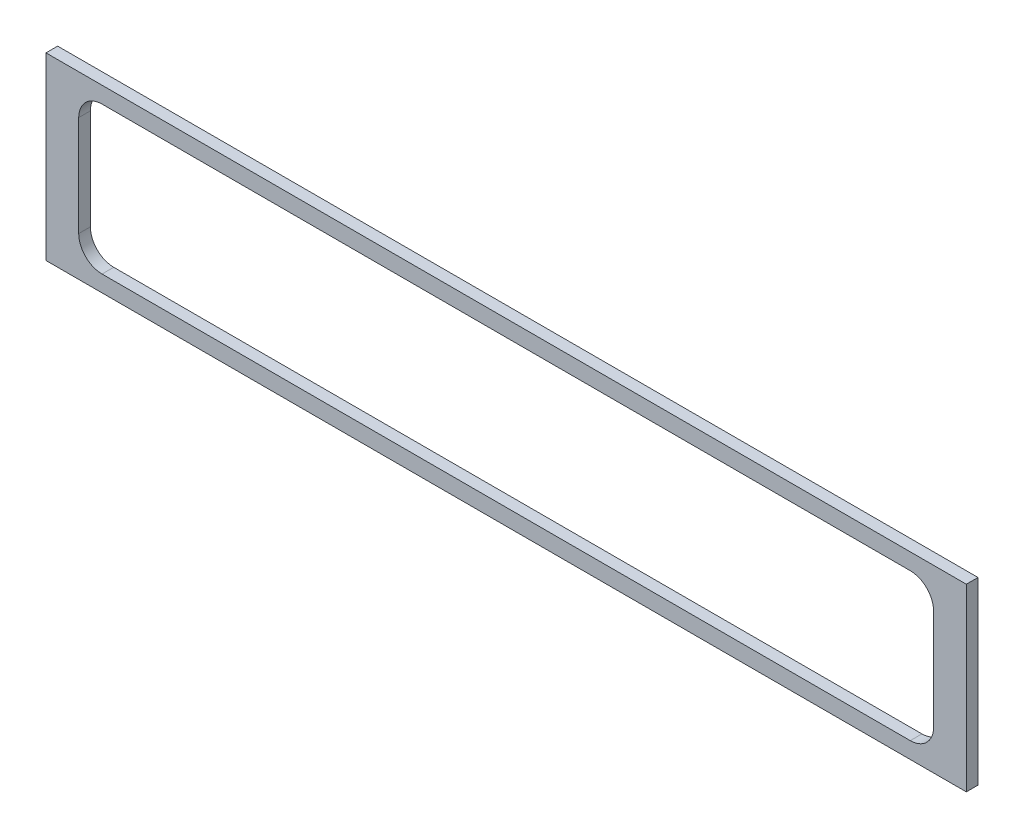
ISO-10303-21;
HEADER;
FILE_DESCRIPTION(('STEP AP214'),'2;1');
FILE_NAME('part.step','',(''),(''),'','','');
FILE_SCHEMA(('AUTOMOTIVE_DESIGN { 1 0 10303 214 1 1 1 1 }'));
ENDSEC;
DATA;
#1=APPLICATION_CONTEXT('core data for automotive mechanical design processes');
#2=APPLICATION_PROTOCOL_DEFINITION('international standard','automotive_design',2000,#1);
#3=PRODUCT_CONTEXT('',#1,'mechanical');
#4=PRODUCT('Part','Part','',(#3));
#5=PRODUCT_RELATED_PRODUCT_CATEGORY('part','',(#4));
#6=PRODUCT_DEFINITION_FORMATION('','',#4);
#7=PRODUCT_DEFINITION_CONTEXT('part definition',#1,'design');
#8=PRODUCT_DEFINITION('design','',#6,#7);
#9=PRODUCT_DEFINITION_SHAPE('','',#8);
#10=(LENGTH_UNIT() NAMED_UNIT(*) SI_UNIT(.MILLI.,.METRE.));
#11=(NAMED_UNIT(*) PLANE_ANGLE_UNIT() SI_UNIT($,.RADIAN.));
#12=(NAMED_UNIT(*) SI_UNIT($,.STERADIAN.) SOLID_ANGLE_UNIT());
#13=UNCERTAINTY_MEASURE_WITH_UNIT(LENGTH_MEASURE(1.E-05),#10,'distance_accuracy_value','');
#14=(GEOMETRIC_REPRESENTATION_CONTEXT(3) GLOBAL_UNCERTAINTY_ASSIGNED_CONTEXT((#13)) GLOBAL_UNIT_ASSIGNED_CONTEXT((#10,
#11,#12)) REPRESENTATION_CONTEXT('',''));
#15=CARTESIAN_POINT('',(0.,0.,0.));
#16=DIRECTION('',(0.,0.,1.));
#17=DIRECTION('',(1.,0.,0.));
#18=AXIS2_PLACEMENT_3D('',#15,#16,#17);
#19=CARTESIAN_POINT('',(-279.604690639291,-32.7729831144466,5.));
#20=DIRECTION('',(1.,0.,0.));
#21=DIRECTION('',(0.,0.,-1.));
#22=AXIS2_PLACEMENT_3D('',#19,#20,#21);
#23=PLANE('',#22);
#24=DIRECTION('',(0.,-1.,0.));
#25=VECTOR('',#24,1.);
#26=CARTESIAN_POINT('',(-279.604690639291,-32.7729831144466,0.));
#27=LINE('',#26,#25);
#28=CARTESIAN_POINT('',(-279.604690639291,-32.7729831144466,0.));
#29=VERTEX_POINT('',#28);
#30=CARTESIAN_POINT('',(-279.604690639291,-109.772983114447,0.));
#31=VERTEX_POINT('',#30);
#32=EDGE_CURVE('E175',#29,#31,#27,.T.);
#33=ORIENTED_EDGE('',*,*,#32,.T.);
#34=DIRECTION('',(0.,0.,-1.));
#35=VECTOR('',#34,1.);
#36=CARTESIAN_POINT('',(-279.604690639291,-109.772983114447,5.));
#37=LINE('',#36,#35);
#38=CARTESIAN_POINT('',(-279.604690639291,-109.772983114447,5.));
#39=VERTEX_POINT('',#38);
#40=EDGE_CURVE('E229',#39,#31,#37,.T.);
#41=ORIENTED_EDGE('',*,*,#40,.F.);
#42=DIRECTION('',(0.,-1.,0.));
#43=VECTOR('',#42,1.);
#44=CARTESIAN_POINT('',(-279.604690639291,-32.7729831144466,5.));
#45=LINE('',#44,#43);
#46=CARTESIAN_POINT('',(-279.604690639291,-32.7729831144466,5.));
#47=VERTEX_POINT('',#46);
#48=EDGE_CURVE('E192',#47,#39,#45,.T.);
#49=ORIENTED_EDGE('',*,*,#48,.F.);
#50=DIRECTION('',(0.,0.,-1.));
#51=VECTOR('',#50,1.);
#52=CARTESIAN_POINT('',(-279.604690639291,-32.7729831144466,5.));
#53=LINE('',#52,#51);
#54=EDGE_CURVE('E206',#47,#29,#53,.T.);
#55=ORIENTED_EDGE('',*,*,#54,.T.);
#56=EDGE_LOOP('',(#33,#41,#49,#55));
#57=FACE_BOUND('',#56,.T.);
#58=ADVANCED_FACE('F38',(#57),#23,.F.);
#59=CARTESIAN_POINT('',(-279.604690639291,-109.772983114447,5.));
#60=DIRECTION('',(0.,1.,0.));
#61=DIRECTION('',(0.,0.,1.));
#62=AXIS2_PLACEMENT_3D('',#59,#60,#61);
#63=PLANE('',#62);
#64=DIRECTION('',(1.,0.,0.));
#65=VECTOR('',#64,1.);
#66=CARTESIAN_POINT('',(-279.604690639291,-109.772983114447,0.));
#67=LINE('',#66,#65);
#68=CARTESIAN_POINT('',(114.395309360709,-109.772983114447,0.));
#69=VERTEX_POINT('',#68);
#70=EDGE_CURVE('E210',#31,#69,#67,.T.);
#71=ORIENTED_EDGE('',*,*,#70,.T.);
#72=DIRECTION('',(0.,0.,-1.));
#73=VECTOR('',#72,1.);
#74=CARTESIAN_POINT('',(114.395309360709,-109.772983114447,5.));
#75=LINE('',#74,#73);
#76=CARTESIAN_POINT('',(114.395309360709,-109.772983114447,5.));
#77=VERTEX_POINT('',#76);
#78=EDGE_CURVE('E225',#77,#69,#75,.T.);
#79=ORIENTED_EDGE('',*,*,#78,.F.);
#80=DIRECTION('',(1.,0.,0.));
#81=VECTOR('',#80,1.);
#82=CARTESIAN_POINT('',(-279.604690639291,-109.772983114447,5.));
#83=LINE('',#82,#81);
#84=EDGE_CURVE('E196',#39,#77,#83,.T.);
#85=ORIENTED_EDGE('',*,*,#84,.F.);
#86=ORIENTED_EDGE('',*,*,#40,.T.);
#87=EDGE_LOOP('',(#71,#79,#85,#86));
#88=FACE_BOUND('',#87,.T.);
#89=ADVANCED_FACE('F290',(#88),#63,.F.);
#90=CARTESIAN_POINT('',(114.395309360709,-32.7729831144466,5.));
#91=DIRECTION('',(-1.,0.,0.));
#92=DIRECTION('',(0.,-1.,0.));
#93=AXIS2_PLACEMENT_3D('',#90,#91,#92);
#94=PLANE('',#93);
#95=DIRECTION('',(0.,1.,0.));
#96=VECTOR('',#95,1.);
#97=CARTESIAN_POINT('',(114.395309360709,-32.7729831144466,0.));
#98=LINE('',#97,#96);
#99=CARTESIAN_POINT('',(114.395309360709,-32.7729831144466,0.));
#100=VERTEX_POINT('',#99);
#101=EDGE_CURVE('E213',#69,#100,#98,.T.);
#102=ORIENTED_EDGE('',*,*,#101,.T.);
#103=DIRECTION('',(0.,0.,-1.));
#104=VECTOR('',#103,1.);
#105=CARTESIAN_POINT('',(114.395309360709,-32.7729831144466,5.));
#106=LINE('',#105,#104);
#107=CARTESIAN_POINT('',(114.395309360709,-32.7729831144466,5.));
#108=VERTEX_POINT('',#107);
#109=EDGE_CURVE('E221',#108,#100,#106,.T.);
#110=ORIENTED_EDGE('',*,*,#109,.F.);
#111=DIRECTION('',(0.,1.,0.));
#112=VECTOR('',#111,1.);
#113=CARTESIAN_POINT('',(114.395309360709,-32.7729831144466,5.));
#114=LINE('',#113,#112);
#115=EDGE_CURVE('E200',#77,#108,#114,.T.);
#116=ORIENTED_EDGE('',*,*,#115,.F.);
#117=ORIENTED_EDGE('',*,*,#78,.T.);
#118=EDGE_LOOP('',(#102,#110,#116,#117));
#119=FACE_BOUND('',#118,.T.);
#120=ADVANCED_FACE('F295',(#119),#94,.F.);
#121=CARTESIAN_POINT('',(-279.604690639291,-32.7729831144466,5.));
#122=DIRECTION('',(0.,-1.,0.));
#123=DIRECTION('',(0.,0.,-1.));
#124=AXIS2_PLACEMENT_3D('',#121,#122,#123);
#125=PLANE('',#124);
#126=DIRECTION('',(-1.,0.,0.));
#127=VECTOR('',#126,1.);
#128=CARTESIAN_POINT('',(-279.604690639291,-32.7729831144466,0.));
#129=LINE('',#128,#127);
#130=EDGE_CURVE('E197',#100,#29,#129,.T.);
#131=ORIENTED_EDGE('',*,*,#130,.T.);
#132=ORIENTED_EDGE('',*,*,#54,.F.);
#133=DIRECTION('',(-1.,0.,0.));
#134=VECTOR('',#133,1.);
#135=CARTESIAN_POINT('',(-279.604690639291,-32.7729831144466,5.));
#136=LINE('',#135,#134);
#137=EDGE_CURVE('E203',#108,#47,#136,.T.);
#138=ORIENTED_EDGE('',*,*,#137,.F.);
#139=ORIENTED_EDGE('',*,*,#109,.T.);
#140=EDGE_LOOP('',(#131,#132,#138,#139));
#141=FACE_BOUND('',#140,.T.);
#142=ADVANCED_FACE('F308',(#141),#125,.F.);
#143=CARTESIAN_POINT('',(0.,0.,5.));
#144=DIRECTION('',(0.,0.,1.));
#145=DIRECTION('',(1.,0.,0.));
#146=AXIS2_PLACEMENT_3D('',#143,#144,#145);
#147=PLANE('',#146);
#148=CARTESIAN_POINT('',(90.3953093607094,-49.7729831144466,5.));
#149=DIRECTION('',(0.,0.,1.));
#150=DIRECTION('',(-1.,0.,0.));
#151=AXIS2_PLACEMENT_3D('',#148,#149,#150);
#152=CIRCLE('',#151,9.99999999999999);
#153=CARTESIAN_POINT('',(100.395309360709,-49.7729831144466,5.));
#154=VERTEX_POINT('',#153);
#155=CARTESIAN_POINT('',(90.3953093607094,-39.7729831144466,5.));
#156=VERTEX_POINT('',#155);
#157=EDGE_CURVE('E53',#154,#156,#152,.T.);
#158=ORIENTED_EDGE('',*,*,#157,.F.);
#159=DIRECTION('',(0.,1.,0.));
#160=VECTOR('',#159,1.);
#161=CARTESIAN_POINT('',(100.395309360709,-49.7729831144466,5.));
#162=LINE('',#161,#160);
#163=CARTESIAN_POINT('',(100.395309360709,-92.7729831144465,5.));
#164=VERTEX_POINT('',#163);
#165=EDGE_CURVE('E168',#164,#154,#162,.T.);
#166=ORIENTED_EDGE('',*,*,#165,.F.);
#167=CARTESIAN_POINT('',(90.3953093607094,-92.7729831144465,5.));
#168=DIRECTION('',(0.,0.,1.));
#169=DIRECTION('',(-1.,0.,0.));
#170=AXIS2_PLACEMENT_3D('',#167,#168,#169);
#171=CIRCLE('',#170,9.99999999999998);
#172=CARTESIAN_POINT('',(90.3953093607094,-102.772983114447,5.));
#173=VERTEX_POINT('',#172);
#174=EDGE_CURVE('E164',#173,#164,#171,.T.);
#175=ORIENTED_EDGE('',*,*,#174,.F.);
#176=DIRECTION('',(1.,0.,0.));
#177=VECTOR('',#176,1.);
#178=CARTESIAN_POINT('',(-255.604690639291,-102.772983114447,5.));
#179=LINE('',#178,#177);
#180=CARTESIAN_POINT('',(-255.604690639291,-102.772983114447,5.));
#181=VERTEX_POINT('',#180);
#182=EDGE_CURVE('E160',#181,#173,#179,.T.);
#183=ORIENTED_EDGE('',*,*,#182,.F.);
#184=CARTESIAN_POINT('',(-255.604690639291,-92.7729831144465,5.));
#185=DIRECTION('',(0.,0.,1.));
#186=DIRECTION('',(-1.,0.,0.));
#187=AXIS2_PLACEMENT_3D('',#184,#185,#186);
#188=CIRCLE('',#187,10.);
#189=CARTESIAN_POINT('',(-265.604690639291,-92.7729831144465,5.));
#190=VERTEX_POINT('',#189);
#191=EDGE_CURVE('E153',#190,#181,#188,.T.);
#192=ORIENTED_EDGE('',*,*,#191,.F.);
#193=DIRECTION('',(0.,-1.,0.));
#194=VECTOR('',#193,1.);
#195=CARTESIAN_POINT('',(-265.604690639291,-49.7729831144466,5.));
#196=LINE('',#195,#194);
#197=CARTESIAN_POINT('',(-265.604690639291,-49.7729831144466,5.));
#198=VERTEX_POINT('',#197);
#199=EDGE_CURVE('E149',#198,#190,#196,.T.);
#200=ORIENTED_EDGE('',*,*,#199,.F.);
#201=CARTESIAN_POINT('',(-255.604690639291,-49.7729831144466,5.));
#202=DIRECTION('',(0.,0.,1.));
#203=DIRECTION('',(-1.,0.,0.));
#204=AXIS2_PLACEMENT_3D('',#201,#202,#203);
#205=CIRCLE('',#204,10.);
#206=CARTESIAN_POINT('',(-255.604690639291,-39.7729831144466,5.));
#207=VERTEX_POINT('',#206);
#208=EDGE_CURVE('E130',#207,#198,#205,.T.);
#209=ORIENTED_EDGE('',*,*,#208,.F.);
#210=DIRECTION('',(-1.,0.,0.));
#211=VECTOR('',#210,1.);
#212=CARTESIAN_POINT('',(-255.604690639291,-39.7729831144466,5.));
#213=LINE('',#212,#211);
#214=EDGE_CURVE('E140',#156,#207,#213,.T.);
#215=ORIENTED_EDGE('',*,*,#214,.F.);
#216=EDGE_LOOP('',(#158,#166,#175,#183,#192,#200,#209,#215));
#217=FACE_BOUND('',#216,.T.);
#218=ORIENTED_EDGE('',*,*,#48,.T.);
#219=ORIENTED_EDGE('',*,*,#84,.T.);
#220=ORIENTED_EDGE('',*,*,#115,.T.);
#221=ORIENTED_EDGE('',*,*,#137,.T.);
#222=EDGE_LOOP('',(#218,#219,#220,#221));
#223=FACE_BOUND('',#222,.T.);
#224=ADVANCED_FACE('F145',(#217,#223),#147,.T.);
#225=CARTESIAN_POINT('',(0.,0.,0.));
#226=DIRECTION('',(0.,0.,1.));
#227=DIRECTION('',(1.,0.,0.));
#228=AXIS2_PLACEMENT_3D('',#225,#226,#227);
#229=PLANE('',#228);
#230=DIRECTION('',(0.,1.,0.));
#231=VECTOR('',#230,1.);
#232=CARTESIAN_POINT('',(100.395309360709,0.,0.));
#233=LINE('',#232,#231);
#234=CARTESIAN_POINT('',(100.395309360709,-92.7729831144465,0.));
#235=VERTEX_POINT('',#234);
#236=CARTESIAN_POINT('',(100.395309360709,-49.7729831144466,0.));
#237=VERTEX_POINT('',#236);
#238=EDGE_CURVE('E46',#235,#237,#233,.T.);
#239=ORIENTED_EDGE('',*,*,#238,.T.);
#240=CARTESIAN_POINT('',(90.3953093607094,-49.7729831144466,0.));
#241=DIRECTION('',(0.,0.,1.));
#242=DIRECTION('',(1.,0.,0.));
#243=AXIS2_PLACEMENT_3D('',#240,#241,#242);
#244=CIRCLE('',#243,9.99999999999999);
#245=CARTESIAN_POINT('',(90.3953093607094,-39.7729831144466,0.));
#246=VERTEX_POINT('',#245);
#247=EDGE_CURVE('E11',#237,#246,#244,.T.);
#248=ORIENTED_EDGE('',*,*,#247,.T.);
#249=DIRECTION('',(-1.,0.,0.));
#250=VECTOR('',#249,1.);
#251=CARTESIAN_POINT('',(0.,-39.7729831144466,0.));
#252=LINE('',#251,#250);
#253=CARTESIAN_POINT('',(-255.604690639291,-39.7729831144466,0.));
#254=VERTEX_POINT('',#253);
#255=EDGE_CURVE('E233',#246,#254,#252,.T.);
#256=ORIENTED_EDGE('',*,*,#255,.T.);
#257=CARTESIAN_POINT('',(-255.604690639291,-49.7729831144466,0.));
#258=DIRECTION('',(0.,0.,1.));
#259=DIRECTION('',(1.,0.,0.));
#260=AXIS2_PLACEMENT_3D('',#257,#258,#259);
#261=CIRCLE('',#260,10.);
#262=CARTESIAN_POINT('',(-265.604690639291,-49.7729831144466,0.));
#263=VERTEX_POINT('',#262);
#264=EDGE_CURVE('E133',#254,#263,#261,.T.);
#265=ORIENTED_EDGE('',*,*,#264,.T.);
#266=DIRECTION('',(0.,-1.,0.));
#267=VECTOR('',#266,1.);
#268=CARTESIAN_POINT('',(-265.604690639291,0.,0.));
#269=LINE('',#268,#267);
#270=CARTESIAN_POINT('',(-265.604690639291,-92.7729831144465,0.));
#271=VERTEX_POINT('',#270);
#272=EDGE_CURVE('E238',#263,#271,#269,.T.);
#273=ORIENTED_EDGE('',*,*,#272,.T.);
#274=CARTESIAN_POINT('',(-255.604690639291,-92.7729831144465,0.));
#275=DIRECTION('',(0.,0.,1.));
#276=DIRECTION('',(1.,0.,0.));
#277=AXIS2_PLACEMENT_3D('',#274,#275,#276);
#278=CIRCLE('',#277,10.);
#279=CARTESIAN_POINT('',(-255.604690639291,-102.772983114447,0.));
#280=VERTEX_POINT('',#279);
#281=EDGE_CURVE('E242',#271,#280,#278,.T.);
#282=ORIENTED_EDGE('',*,*,#281,.T.);
#283=DIRECTION('',(1.,0.,0.));
#284=VECTOR('',#283,1.);
#285=CARTESIAN_POINT('',(0.,-102.772983114447,0.));
#286=LINE('',#285,#284);
#287=CARTESIAN_POINT('',(90.3953093607094,-102.772983114447,0.));
#288=VERTEX_POINT('',#287);
#289=EDGE_CURVE('E246',#280,#288,#286,.T.);
#290=ORIENTED_EDGE('',*,*,#289,.T.);
#291=CARTESIAN_POINT('',(90.3953093607094,-92.7729831144465,0.));
#292=DIRECTION('',(0.,0.,1.));
#293=DIRECTION('',(1.,0.,0.));
#294=AXIS2_PLACEMENT_3D('',#291,#292,#293);
#295=CIRCLE('',#294,9.99999999999998);
#296=EDGE_CURVE('E250',#288,#235,#295,.T.);
#297=ORIENTED_EDGE('',*,*,#296,.T.);
#298=EDGE_LOOP('',(#239,#248,#256,#265,#273,#282,#290,#297));
#299=FACE_BOUND('',#298,.T.);
#300=ORIENTED_EDGE('',*,*,#32,.F.);
#301=ORIENTED_EDGE('',*,*,#130,.F.);
#302=ORIENTED_EDGE('',*,*,#101,.F.);
#303=ORIENTED_EDGE('',*,*,#70,.F.);
#304=EDGE_LOOP('',(#300,#301,#302,#303));
#305=FACE_BOUND('',#304,.T.);
#306=ADVANCED_FACE('F256',(#299,#305),#229,.F.);
#307=CARTESIAN_POINT('',(90.3953093607094,-49.7729831144466,-5.));
#308=DIRECTION('',(0.,0.,1.));
#309=DIRECTION('',(1.,0.,0.));
#310=AXIS2_PLACEMENT_3D('',#307,#308,#309);
#311=CYLINDRICAL_SURFACE('',#310,9.99999999999999);
#312=DIRECTION('',(0.,0.,1.));
#313=VECTOR('',#312,1.);
#314=CARTESIAN_POINT('',(100.395309360709,-49.7729831144466,-5.));
#315=LINE('',#314,#313);
#316=EDGE_CURVE('E172',#237,#154,#315,.T.);
#317=ORIENTED_EDGE('',*,*,#316,.T.);
#318=ORIENTED_EDGE('',*,*,#157,.T.);
#319=DIRECTION('',(0.,0.,1.));
#320=VECTOR('',#319,1.);
#321=CARTESIAN_POINT('',(90.3953093607094,-39.7729831144466,-5.));
#322=LINE('',#321,#320);
#323=EDGE_CURVE('E137',#246,#156,#322,.T.);
#324=ORIENTED_EDGE('',*,*,#323,.F.);
#325=ORIENTED_EDGE('',*,*,#247,.F.);
#326=EDGE_LOOP('',(#317,#318,#324,#325));
#327=FACE_BOUND('',#326,.T.);
#328=ADVANCED_FACE('F277',(#327),#311,.F.);
#329=CARTESIAN_POINT('',(100.395309360709,-49.7729831144466,-5.));
#330=DIRECTION('',(1.,0.,0.));
#331=DIRECTION('',(0.,0.,-1.));
#332=AXIS2_PLACEMENT_3D('',#329,#330,#331);
#333=PLANE('',#332);
#334=DIRECTION('',(0.,0.,1.));
#335=VECTOR('',#334,1.);
#336=CARTESIAN_POINT('',(100.395309360709,-92.7729831144465,-5.));
#337=LINE('',#336,#335);
#338=EDGE_CURVE('E176',#235,#164,#337,.T.);
#339=ORIENTED_EDGE('',*,*,#338,.T.);
#340=ORIENTED_EDGE('',*,*,#165,.T.);
#341=ORIENTED_EDGE('',*,*,#316,.F.);
#342=ORIENTED_EDGE('',*,*,#238,.F.);
#343=EDGE_LOOP('',(#339,#340,#341,#342));
#344=FACE_BOUND('',#343,.T.);
#345=ADVANCED_FACE('F261',(#344),#333,.F.);
#346=CARTESIAN_POINT('',(90.3953093607094,-92.7729831144465,-5.));
#347=DIRECTION('',(0.,0.,1.));
#348=DIRECTION('',(1.,0.,0.));
#349=AXIS2_PLACEMENT_3D('',#346,#347,#348);
#350=CYLINDRICAL_SURFACE('',#349,9.99999999999998);
#351=DIRECTION('',(0.,0.,1.));
#352=VECTOR('',#351,1.);
#353=CARTESIAN_POINT('',(90.3953093607094,-102.772983114447,-5.));
#354=LINE('',#353,#352);
#355=EDGE_CURVE('E179',#288,#173,#354,.T.);
#356=ORIENTED_EDGE('',*,*,#355,.T.);
#357=ORIENTED_EDGE('',*,*,#174,.T.);
#358=ORIENTED_EDGE('',*,*,#338,.F.);
#359=ORIENTED_EDGE('',*,*,#296,.F.);
#360=EDGE_LOOP('',(#356,#357,#358,#359));
#361=FACE_BOUND('',#360,.T.);
#362=ADVANCED_FACE('F263',(#361),#350,.F.);
#363=CARTESIAN_POINT('',(-255.604690639291,-102.772983114447,-5.));
#364=DIRECTION('',(0.,-1.,0.));
#365=DIRECTION('',(1.,0.,0.));
#366=AXIS2_PLACEMENT_3D('',#363,#364,#365);
#367=PLANE('',#366);
#368=DIRECTION('',(0.,0.,1.));
#369=VECTOR('',#368,1.);
#370=CARTESIAN_POINT('',(-255.604690639291,-102.772983114447,-5.));
#371=LINE('',#370,#369);
#372=EDGE_CURVE('E182',#280,#181,#371,.T.);
#373=ORIENTED_EDGE('',*,*,#372,.T.);
#374=ORIENTED_EDGE('',*,*,#182,.T.);
#375=ORIENTED_EDGE('',*,*,#355,.F.);
#376=ORIENTED_EDGE('',*,*,#289,.F.);
#377=EDGE_LOOP('',(#373,#374,#375,#376));
#378=FACE_BOUND('',#377,.T.);
#379=ADVANCED_FACE('F270',(#378),#367,.F.);
#380=CARTESIAN_POINT('',(-255.604690639291,-92.7729831144465,-5.));
#381=DIRECTION('',(0.,0.,1.));
#382=DIRECTION('',(1.,0.,0.));
#383=AXIS2_PLACEMENT_3D('',#380,#381,#382);
#384=CYLINDRICAL_SURFACE('',#383,10.);
#385=DIRECTION('',(0.,0.,1.));
#386=VECTOR('',#385,1.);
#387=CARTESIAN_POINT('',(-265.604690639291,-92.7729831144465,-5.));
#388=LINE('',#387,#386);
#389=EDGE_CURVE('E185',#271,#190,#388,.T.);
#390=ORIENTED_EDGE('',*,*,#389,.T.);
#391=ORIENTED_EDGE('',*,*,#191,.T.);
#392=ORIENTED_EDGE('',*,*,#372,.F.);
#393=ORIENTED_EDGE('',*,*,#281,.F.);
#394=EDGE_LOOP('',(#390,#391,#392,#393));
#395=FACE_BOUND('',#394,.T.);
#396=ADVANCED_FACE('F273',(#395),#384,.F.);
#397=CARTESIAN_POINT('',(-265.604690639291,-49.7729831144466,-5.));
#398=DIRECTION('',(-1.,0.,0.));
#399=DIRECTION('',(0.,0.,1.));
#400=AXIS2_PLACEMENT_3D('',#397,#398,#399);
#401=PLANE('',#400);
#402=DIRECTION('',(0.,0.,1.));
#403=VECTOR('',#402,1.);
#404=CARTESIAN_POINT('',(-265.604690639291,-49.7729831144466,-5.));
#405=LINE('',#404,#403);
#406=EDGE_CURVE('E136',#263,#198,#405,.T.);
#407=ORIENTED_EDGE('',*,*,#406,.T.);
#408=ORIENTED_EDGE('',*,*,#199,.T.);
#409=ORIENTED_EDGE('',*,*,#389,.F.);
#410=ORIENTED_EDGE('',*,*,#272,.F.);
#411=EDGE_LOOP('',(#407,#408,#409,#410));
#412=FACE_BOUND('',#411,.T.);
#413=ADVANCED_FACE('F276',(#412),#401,.F.);
#414=CARTESIAN_POINT('',(-255.604690639291,-49.7729831144466,-5.));
#415=DIRECTION('',(0.,0.,1.));
#416=DIRECTION('',(1.,0.,0.));
#417=AXIS2_PLACEMENT_3D('',#414,#415,#416);
#418=CYLINDRICAL_SURFACE('',#417,10.);
#419=DIRECTION('',(0.,0.,1.));
#420=VECTOR('',#419,1.);
#421=CARTESIAN_POINT('',(-255.604690639291,-39.7729831144466,-5.));
#422=LINE('',#421,#420);
#423=EDGE_CURVE('E61',#254,#207,#422,.T.);
#424=ORIENTED_EDGE('',*,*,#423,.T.);
#425=ORIENTED_EDGE('',*,*,#208,.T.);
#426=ORIENTED_EDGE('',*,*,#406,.F.);
#427=ORIENTED_EDGE('',*,*,#264,.F.);
#428=EDGE_LOOP('',(#424,#425,#426,#427));
#429=FACE_BOUND('',#428,.T.);
#430=ADVANCED_FACE('F127',(#429),#418,.F.);
#431=CARTESIAN_POINT('',(-255.604690639291,-39.7729831144466,-5.));
#432=DIRECTION('',(0.,1.,0.));
#433=DIRECTION('',(0.,0.,1.));
#434=AXIS2_PLACEMENT_3D('',#431,#432,#433);
#435=PLANE('',#434);
#436=ORIENTED_EDGE('',*,*,#323,.T.);
#437=ORIENTED_EDGE('',*,*,#214,.T.);
#438=ORIENTED_EDGE('',*,*,#423,.F.);
#439=ORIENTED_EDGE('',*,*,#255,.F.);
#440=EDGE_LOOP('',(#436,#437,#438,#439));
#441=FACE_BOUND('',#440,.T.);
#442=ADVANCED_FACE('F141',(#441),#435,.F.);
#443=CLOSED_SHELL('',(#58,#89,#120,#142,#224,#306,#328,#345,#362,#379,#396,#413,#430,#442));
#444=MANIFOLD_SOLID_BREP('B2',#443);
#445=ADVANCED_BREP_SHAPE_REPRESENTATION('',(#18,#444),#14);
#446=SHAPE_DEFINITION_REPRESENTATION(#9,#445);
ENDSEC;
END-ISO-10303-21;
